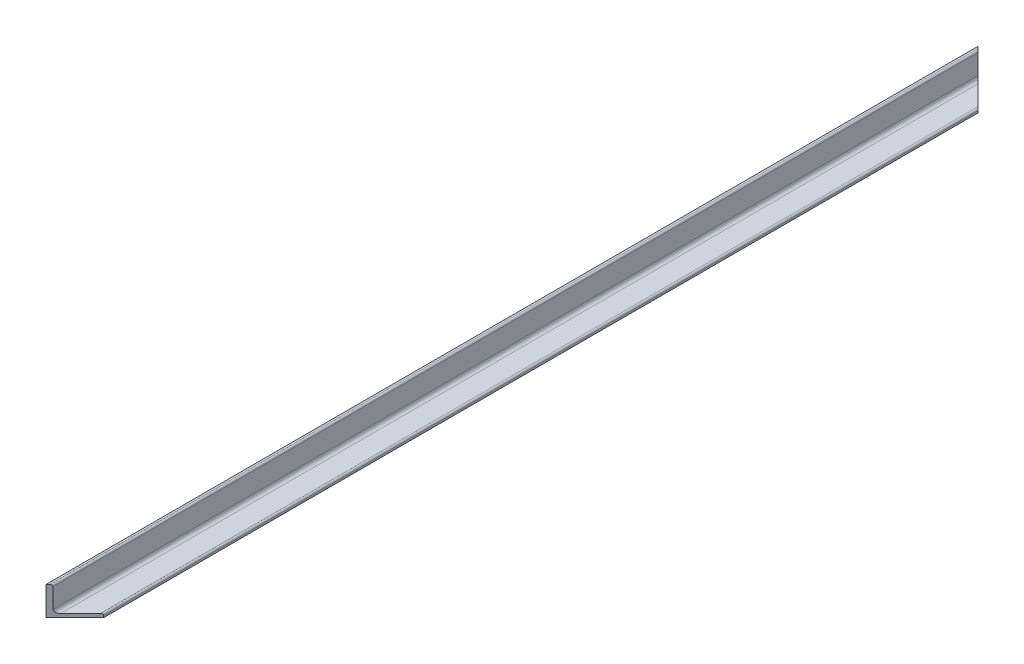
ISO-10303-21;
HEADER;
FILE_DESCRIPTION(('STEP AP214'),'2;1');
FILE_NAME('part.step','',(''),(''),'','','');
FILE_SCHEMA(('AUTOMOTIVE_DESIGN { 1 0 10303 214 1 1 1 1 }'));
ENDSEC;
DATA;
#1=APPLICATION_CONTEXT('core data for automotive mechanical design processes');
#2=APPLICATION_PROTOCOL_DEFINITION('international standard','automotive_design',2000,#1);
#3=PRODUCT_CONTEXT('',#1,'mechanical');
#4=PRODUCT('Part','Part','',(#3));
#5=PRODUCT_RELATED_PRODUCT_CATEGORY('part','',(#4));
#6=PRODUCT_DEFINITION_FORMATION('','',#4);
#7=PRODUCT_DEFINITION_CONTEXT('part definition',#1,'design');
#8=PRODUCT_DEFINITION('design','',#6,#7);
#9=PRODUCT_DEFINITION_SHAPE('','',#8);
#10=(LENGTH_UNIT() NAMED_UNIT(*) SI_UNIT(.MILLI.,.METRE.));
#11=(NAMED_UNIT(*) PLANE_ANGLE_UNIT() SI_UNIT($,.RADIAN.));
#12=(NAMED_UNIT(*) SI_UNIT($,.STERADIAN.) SOLID_ANGLE_UNIT());
#13=UNCERTAINTY_MEASURE_WITH_UNIT(LENGTH_MEASURE(1.E-05),#10,'distance_accuracy_value','');
#14=(GEOMETRIC_REPRESENTATION_CONTEXT(3) GLOBAL_UNCERTAINTY_ASSIGNED_CONTEXT((#13)) GLOBAL_UNIT_ASSIGNED_CONTEXT((#10,
#11,#12)) REPRESENTATION_CONTEXT('',''));
#15=CARTESIAN_POINT('',(0.,0.,0.));
#16=DIRECTION('',(0.,0.,1.));
#17=DIRECTION('',(1.,0.,0.));
#18=AXIS2_PLACEMENT_3D('',#15,#16,#17);
#19=CARTESIAN_POINT('',(-5.0000027E-08,0.,5.0000027E-08));
#20=DIRECTION('',(-0.707106781186548,0.,0.707106781186547));
#21=DIRECTION('',(0.707106781186547,0.,0.707106781186548));
#22=AXIS2_PLACEMENT_3D('',#19,#20,#21);
#23=PLANE('',#22);
#24=DIRECTION('',(-0.707106781186547,0.,-0.707106781186548));
#25=VECTOR('',#24,1.);
#26=CARTESIAN_POINT('',(2.4765,38.1,2.47650010000005));
#27=LINE('',#26,#25);
#28=CARTESIAN_POINT('',(2.4765,38.1,2.47650010000005));
#29=VERTEX_POINT('',#28);
#30=CARTESIAN_POINT('',(-1.22995773751037E-08,38.1,3.33697849613079E-08));
#31=VERTEX_POINT('',#30);
#32=EDGE_CURVE('E34',#29,#31,#27,.T.);
#33=ORIENTED_EDGE('',*,*,#32,.F.);
#34=CARTESIAN_POINT('',(2.4765,35.814,2.47650010000005));
#35=DIRECTION('',(-0.707106781186548,0.,0.707106781186547));
#36=DIRECTION('',(-0.707106781186547,0.,-0.707106781186548));
#37=AXIS2_PLACEMENT_3D('',#34,#35,#36);
#38=ELLIPSE('',#37,3.23289220358491,2.286);
#39=CARTESIAN_POINT('',(4.7625,35.814,4.76250010000005));
#40=VERTEX_POINT('',#39);
#41=EDGE_CURVE('E130',#40,#29,#38,.T.);
#42=ORIENTED_EDGE('',*,*,#41,.F.);
#43=DIRECTION('',(0.,1.,0.));
#44=VECTOR('',#43,1.);
#45=CARTESIAN_POINT('',(4.7625,9.5885,4.76250010000008));
#46=LINE('',#45,#44);
#47=CARTESIAN_POINT('',(4.7625,9.5885,4.76250010000008));
#48=VERTEX_POINT('',#47);
#49=EDGE_CURVE('E137',#48,#40,#46,.T.);
#50=ORIENTED_EDGE('',*,*,#49,.F.);
#51=CARTESIAN_POINT('',(9.5885,9.5885,9.58850010000008));
#52=DIRECTION('',(0.707106781186548,0.,-0.707106781186548));
#53=DIRECTION('',(-0.707106781186548,0.,-0.707106781186548));
#54=AXIS2_PLACEMENT_3D('',#51,#52,#53);
#55=ELLIPSE('',#54,6.82499465201256,4.826);
#56=CARTESIAN_POINT('',(9.5885,4.7625,9.58850010000008));
#57=VERTEX_POINT('',#56);
#58=EDGE_CURVE('E144',#57,#48,#55,.T.);
#59=ORIENTED_EDGE('',*,*,#58,.F.);
#60=DIRECTION('',(-0.707106781186547,0.,-0.707106781186548));
#61=VECTOR('',#60,1.);
#62=CARTESIAN_POINT('',(35.814,4.7625,35.8140001000001));
#63=LINE('',#62,#61);
#64=CARTESIAN_POINT('',(35.814,4.7625,35.8140001000001));
#65=VERTEX_POINT('',#64);
#66=EDGE_CURVE('E26',#65,#57,#63,.T.);
#67=ORIENTED_EDGE('',*,*,#66,.F.);
#68=CARTESIAN_POINT('',(35.814,2.47650000000003,35.8140001000001));
#69=DIRECTION('',(-0.707106781186548,0.,0.707106781186547));
#70=DIRECTION('',(-0.707106781186547,0.,-0.707106781186548));
#71=AXIS2_PLACEMENT_3D('',#68,#69,#70);
#72=ELLIPSE('',#71,3.23289220358491,2.286);
#73=CARTESIAN_POINT('',(38.1,2.47650000000003,38.1000001000001));
#74=VERTEX_POINT('',#73);
#75=EDGE_CURVE('E123',#74,#65,#72,.T.);
#76=ORIENTED_EDGE('',*,*,#75,.F.);
#77=DIRECTION('',(0.,1.,0.));
#78=VECTOR('',#77,1.);
#79=CARTESIAN_POINT('',(38.1,0.,38.1000001000001));
#80=LINE('',#79,#78);
#81=CARTESIAN_POINT('',(38.1,0.,38.1000001000001));
#82=VERTEX_POINT('',#81);
#83=EDGE_CURVE('E102',#82,#74,#80,.T.);
#84=ORIENTED_EDGE('',*,*,#83,.F.);
#85=DIRECTION('',(0.707106781186547,0.,0.707106781186548));
#86=VECTOR('',#85,1.);
#87=CARTESIAN_POINT('',(-5.00000281102231E-08,0.,5.00000258897769E-08));
#88=LINE('',#87,#86);
#89=CARTESIAN_POINT('',(-1.22995748478585E-08,0.,3.33697869819386E-08));
#90=VERTEX_POINT('',#89);
#91=EDGE_CURVE('E95',#90,#82,#88,.T.);
#92=ORIENTED_EDGE('',*,*,#91,.F.);
#93=DIRECTION('',(0.,1.,0.));
#94=VECTOR('',#93,1.);
#95=CARTESIAN_POINT('',(0.,0.,0.));
#96=LINE('',#95,#94);
#97=EDGE_CURVE('E10',#90,#31,#96,.T.);
#98=ORIENTED_EDGE('',*,*,#97,.T.);
#99=EDGE_LOOP('',(#33,#42,#50,#59,#67,#76,#84,#92,#98));
#100=FACE_BOUND('',#99,.T.);
#101=ADVANCED_FACE('F16',(#100),#23,.F.);
#102=CARTESIAN_POINT('',(9.5885,4.7625,0.));
#103=DIRECTION('',(0.,1.,0.));
#104=DIRECTION('',(0.,0.,1.));
#105=AXIS2_PLACEMENT_3D('',#102,#103,#104);
#106=PLANE('',#105);
#107=ORIENTED_EDGE('',*,*,#66,.T.);
#108=DIRECTION('',(0.,0.,1.));
#109=VECTOR('',#108,1.);
#110=CARTESIAN_POINT('',(9.5885,4.7625,9.58850010000008));
#111=LINE('',#110,#109);
#112=CARTESIAN_POINT('',(9.5885,4.7625,1222.3114999));
#113=VERTEX_POINT('',#112);
#114=EDGE_CURVE('E148',#57,#113,#111,.T.);
#115=ORIENTED_EDGE('',*,*,#114,.T.);
#116=DIRECTION('',(0.707106781186546,0.,-0.707106781186549));
#117=VECTOR('',#116,1.);
#118=CARTESIAN_POINT('',(9.58849999999993,4.7625,1222.3114999));
#119=LINE('',#118,#117);
#120=CARTESIAN_POINT('',(35.814,4.7625,1196.0859999));
#121=VERTEX_POINT('',#120);
#122=EDGE_CURVE('E146',#113,#121,#119,.T.);
#123=ORIENTED_EDGE('',*,*,#122,.T.);
#124=DIRECTION('',(0.,0.,1.));
#125=VECTOR('',#124,1.);
#126=CARTESIAN_POINT('',(35.814,4.7625,35.8140001000001));
#127=LINE('',#126,#125);
#128=EDGE_CURVE('E100',#65,#121,#127,.T.);
#129=ORIENTED_EDGE('',*,*,#128,.F.);
#130=EDGE_LOOP('',(#107,#115,#123,#129));
#131=FACE_BOUND('',#130,.T.);
#132=ADVANCED_FACE('F179',(#131),#106,.T.);
#133=CARTESIAN_POINT('',(9.5885,9.5885,0.));
#134=DIRECTION('',(0.,0.,1.));
#135=DIRECTION('',(1.,0.,0.));
#136=AXIS2_PLACEMENT_3D('',#133,#134,#135);
#137=CYLINDRICAL_SURFACE('',#136,4.826);
#138=ORIENTED_EDGE('',*,*,#58,.T.);
#139=DIRECTION('',(0.,0.,1.));
#140=VECTOR('',#139,1.);
#141=CARTESIAN_POINT('',(4.7625,9.5885,4.76250010000008));
#142=LINE('',#141,#140);
#143=CARTESIAN_POINT('',(4.7625,9.5885,1227.1374999));
#144=VERTEX_POINT('',#143);
#145=EDGE_CURVE('E141',#48,#144,#142,.T.);
#146=ORIENTED_EDGE('',*,*,#145,.T.);
#147=CARTESIAN_POINT('',(9.5885,9.5885,1222.3114999));
#148=DIRECTION('',(0.707106781186548,0.,0.707106781186548));
#149=DIRECTION('',(-0.707106781186548,0.,0.707106781186548));
#150=AXIS2_PLACEMENT_3D('',#147,#148,#149);
#151=ELLIPSE('',#150,6.82499465201256,4.826);
#152=EDGE_CURVE('E138',#144,#113,#151,.T.);
#153=ORIENTED_EDGE('',*,*,#152,.T.);
#154=ORIENTED_EDGE('',*,*,#114,.F.);
#155=EDGE_LOOP('',(#138,#146,#153,#154));
#156=FACE_BOUND('',#155,.T.);
#157=ADVANCED_FACE('F175',(#156),#137,.F.);
#158=CARTESIAN_POINT('',(4.7625,35.814,0.));
#159=DIRECTION('',(1.,0.,0.));
#160=DIRECTION('',(0.,0.,-1.));
#161=AXIS2_PLACEMENT_3D('',#158,#159,#160);
#162=PLANE('',#161);
#163=ORIENTED_EDGE('',*,*,#49,.T.);
#164=DIRECTION('',(0.,0.,1.));
#165=VECTOR('',#164,1.);
#166=CARTESIAN_POINT('',(4.7625,35.814,4.76250010000005));
#167=LINE('',#166,#165);
#168=CARTESIAN_POINT('',(4.7625,35.814,1227.1374999));
#169=VERTEX_POINT('',#168);
#170=EDGE_CURVE('E134',#40,#169,#167,.T.);
#171=ORIENTED_EDGE('',*,*,#170,.T.);
#172=DIRECTION('',(0.,-1.,0.));
#173=VECTOR('',#172,1.);
#174=CARTESIAN_POINT('',(4.7625,35.814,1227.1374999));
#175=LINE('',#174,#173);
#176=EDGE_CURVE('E131',#169,#144,#175,.T.);
#177=ORIENTED_EDGE('',*,*,#176,.T.);
#178=ORIENTED_EDGE('',*,*,#145,.F.);
#179=EDGE_LOOP('',(#163,#171,#177,#178));
#180=FACE_BOUND('',#179,.T.);
#181=ADVANCED_FACE('F173',(#180),#162,.T.);
#182=CARTESIAN_POINT('',(2.4765,35.814,0.));
#183=DIRECTION('',(0.,0.,1.));
#184=DIRECTION('',(1.,0.,0.));
#185=AXIS2_PLACEMENT_3D('',#182,#183,#184);
#186=CYLINDRICAL_SURFACE('',#185,2.286);
#187=ORIENTED_EDGE('',*,*,#41,.T.);
#188=DIRECTION('',(0.,0.,1.));
#189=VECTOR('',#188,1.);
#190=CARTESIAN_POINT('',(2.4765,38.1,2.47650010000005));
#191=LINE('',#190,#189);
#192=CARTESIAN_POINT('',(2.4765,38.1,1229.4234999));
#193=VERTEX_POINT('',#192);
#194=EDGE_CURVE('E127',#29,#193,#191,.T.);
#195=ORIENTED_EDGE('',*,*,#194,.T.);
#196=CARTESIAN_POINT('',(2.4765,35.814,1229.4234999));
#197=DIRECTION('',(-0.707106781186547,0.,-0.707106781186548));
#198=DIRECTION('',(-0.707106781186548,0.,0.707106781186547));
#199=AXIS2_PLACEMENT_3D('',#196,#197,#198);
#200=ELLIPSE('',#199,3.23289220358491,2.286);
#201=EDGE_CURVE('E124',#193,#169,#200,.T.);
#202=ORIENTED_EDGE('',*,*,#201,.T.);
#203=ORIENTED_EDGE('',*,*,#170,.F.);
#204=EDGE_LOOP('',(#187,#195,#202,#203));
#205=FACE_BOUND('',#204,.T.);
#206=ADVANCED_FACE('F170',(#205),#186,.T.);
#207=CARTESIAN_POINT('',(615.94999995,0.,615.94999995));
#208=DIRECTION('',(-0.707106781186547,0.,-0.707106781186548));
#209=DIRECTION('',(-0.707106781186548,0.,0.707106781186547));
#210=AXIS2_PLACEMENT_3D('',#207,#208,#209);
#211=PLANE('',#210);
#212=ORIENTED_EDGE('',*,*,#122,.F.);
#213=ORIENTED_EDGE('',*,*,#152,.F.);
#214=ORIENTED_EDGE('',*,*,#176,.F.);
#215=ORIENTED_EDGE('',*,*,#201,.F.);
#216=DIRECTION('',(0.707106781186562,0.,-0.707106781186533));
#217=VECTOR('',#216,1.);
#218=CARTESIAN_POINT('',(-4.99999922160761E-08,38.1,1231.89999995));
#219=LINE('',#218,#217);
#220=CARTESIAN_POINT('',(-1.2299534452673E-08,38.1,1231.89999996663));
#221=VERTEX_POINT('',#220);
#222=EDGE_CURVE('E120',#221,#193,#219,.T.);
#223=ORIENTED_EDGE('',*,*,#222,.F.);
#224=DIRECTION('',(0.,1.,0.));
#225=VECTOR('',#224,1.);
#226=CARTESIAN_POINT('',(0.,0.,1231.9));
#227=LINE('',#226,#225);
#228=CARTESIAN_POINT('',(-1.22995478616754E-08,0.,1231.89999996663));
#229=VERTEX_POINT('',#228);
#230=EDGE_CURVE('E114',#229,#221,#227,.T.);
#231=ORIENTED_EDGE('',*,*,#230,.F.);
#232=DIRECTION('',(-0.707106781186548,0.,0.707106781186547));
#233=VECTOR('',#232,1.);
#234=CARTESIAN_POINT('',(38.1,0.,1193.7999999));
#235=LINE('',#234,#233);
#236=CARTESIAN_POINT('',(38.1,0.,1193.7999999));
#237=VERTEX_POINT('',#236);
#238=EDGE_CURVE('E83',#237,#229,#235,.T.);
#239=ORIENTED_EDGE('',*,*,#238,.F.);
#240=DIRECTION('',(0.,-1.,0.));
#241=VECTOR('',#240,1.);
#242=CARTESIAN_POINT('',(38.1000000000001,2.47650000000003,1193.7999999));
#243=LINE('',#242,#241);
#244=CARTESIAN_POINT('',(38.1,2.47650000000003,1193.7999999));
#245=VERTEX_POINT('',#244);
#246=EDGE_CURVE('E86',#245,#237,#243,.T.);
#247=ORIENTED_EDGE('',*,*,#246,.F.);
#248=CARTESIAN_POINT('',(35.814,2.47650000000003,1196.0859999));
#249=DIRECTION('',(-0.707106781186547,0.,-0.707106781186548));
#250=DIRECTION('',(-0.707106781186548,0.,0.707106781186547));
#251=AXIS2_PLACEMENT_3D('',#248,#249,#250);
#252=ELLIPSE('',#251,3.23289220358491,2.286);
#253=EDGE_CURVE('E89',#121,#245,#252,.T.);
#254=ORIENTED_EDGE('',*,*,#253,.F.);
#255=EDGE_LOOP('',(#212,#213,#214,#215,#223,#231,#239,#247,#254));
#256=FACE_BOUND('',#255,.T.);
#257=ADVANCED_FACE('F88',(#256),#211,.F.);
#258=CARTESIAN_POINT('',(0.,38.1,0.));
#259=DIRECTION('',(0.,1.,0.));
#260=DIRECTION('',(0.,0.,1.));
#261=AXIS2_PLACEMENT_3D('',#258,#259,#260);
#262=PLANE('',#261);
#263=ORIENTED_EDGE('',*,*,#32,.T.);
#264=DIRECTION('',(0.,0.,1.));
#265=VECTOR('',#264,1.);
#266=CARTESIAN_POINT('',(0.,38.1,0.));
#267=LINE('',#266,#265);
#268=EDGE_CURVE('E110',#31,#221,#267,.T.);
#269=ORIENTED_EDGE('',*,*,#268,.T.);
#270=ORIENTED_EDGE('',*,*,#222,.T.);
#271=ORIENTED_EDGE('',*,*,#194,.F.);
#272=EDGE_LOOP('',(#263,#269,#270,#271));
#273=FACE_BOUND('',#272,.T.);
#274=ADVANCED_FACE('F163',(#273),#262,.T.);
#275=CARTESIAN_POINT('',(35.814,2.47650000000003,0.));
#276=DIRECTION('',(0.,0.,1.));
#277=DIRECTION('',(1.,0.,0.));
#278=AXIS2_PLACEMENT_3D('',#275,#276,#277);
#279=CYLINDRICAL_SURFACE('',#278,2.286);
#280=ORIENTED_EDGE('',*,*,#75,.T.);
#281=ORIENTED_EDGE('',*,*,#128,.T.);
#282=ORIENTED_EDGE('',*,*,#253,.T.);
#283=DIRECTION('',(0.,0.,1.));
#284=VECTOR('',#283,1.);
#285=CARTESIAN_POINT('',(38.1,2.47650000000003,38.1000001000001));
#286=LINE('',#285,#284);
#287=EDGE_CURVE('E94',#74,#245,#286,.T.);
#288=ORIENTED_EDGE('',*,*,#287,.F.);
#289=EDGE_LOOP('',(#280,#281,#282,#288));
#290=FACE_BOUND('',#289,.T.);
#291=ADVANCED_FACE('F18',(#290),#279,.T.);
#292=CARTESIAN_POINT('',(38.1,2.47650000000003,0.));
#293=DIRECTION('',(1.,0.,0.));
#294=DIRECTION('',(0.,0.,-1.));
#295=AXIS2_PLACEMENT_3D('',#292,#293,#294);
#296=PLANE('',#295);
#297=ORIENTED_EDGE('',*,*,#83,.T.);
#298=ORIENTED_EDGE('',*,*,#287,.T.);
#299=ORIENTED_EDGE('',*,*,#246,.T.);
#300=DIRECTION('',(0.,0.,1.));
#301=VECTOR('',#300,1.);
#302=CARTESIAN_POINT('',(38.1,0.,38.1000001000001));
#303=LINE('',#302,#301);
#304=EDGE_CURVE('E111',#82,#237,#303,.T.);
#305=ORIENTED_EDGE('',*,*,#304,.F.);
#306=EDGE_LOOP('',(#297,#298,#299,#305));
#307=FACE_BOUND('',#306,.T.);
#308=ADVANCED_FACE('F104',(#307),#296,.T.);
#309=CARTESIAN_POINT('',(38.1,0.,0.));
#310=DIRECTION('',(0.,-1.,0.));
#311=DIRECTION('',(0.,0.,-1.));
#312=AXIS2_PLACEMENT_3D('',#309,#310,#311);
#313=PLANE('',#312);
#314=ORIENTED_EDGE('',*,*,#91,.T.);
#315=ORIENTED_EDGE('',*,*,#304,.T.);
#316=ORIENTED_EDGE('',*,*,#238,.T.);
#317=DIRECTION('',(0.,0.,1.));
#318=VECTOR('',#317,1.);
#319=CARTESIAN_POINT('',(0.,0.,0.));
#320=LINE('',#319,#318);
#321=EDGE_CURVE('E20',#90,#229,#320,.T.);
#322=ORIENTED_EDGE('',*,*,#321,.F.);
#323=EDGE_LOOP('',(#314,#315,#316,#322));
#324=FACE_BOUND('',#323,.T.);
#325=ADVANCED_FACE('F198',(#324),#313,.T.);
#326=CARTESIAN_POINT('',(0.,0.,0.));
#327=DIRECTION('',(-1.,0.,0.));
#328=DIRECTION('',(0.,0.,1.));
#329=AXIS2_PLACEMENT_3D('',#326,#327,#328);
#330=PLANE('',#329);
#331=ORIENTED_EDGE('',*,*,#230,.T.);
#332=ORIENTED_EDGE('',*,*,#268,.F.);
#333=ORIENTED_EDGE('',*,*,#97,.F.);
#334=ORIENTED_EDGE('',*,*,#321,.T.);
#335=EDGE_LOOP('',(#331,#332,#333,#334));
#336=FACE_BOUND('',#335,.T.);
#337=ADVANCED_FACE('F167',(#336),#330,.T.);
#338=CLOSED_SHELL('',(#101,#132,#157,#181,#206,#257,#274,#291,#308,#325,#337));
#339=MANIFOLD_SOLID_BREP('B1',#338);
#340=ADVANCED_BREP_SHAPE_REPRESENTATION('',(#18,#339),#14);
#341=SHAPE_DEFINITION_REPRESENTATION(#9,#340);
ENDSEC;
END-ISO-10303-21;
